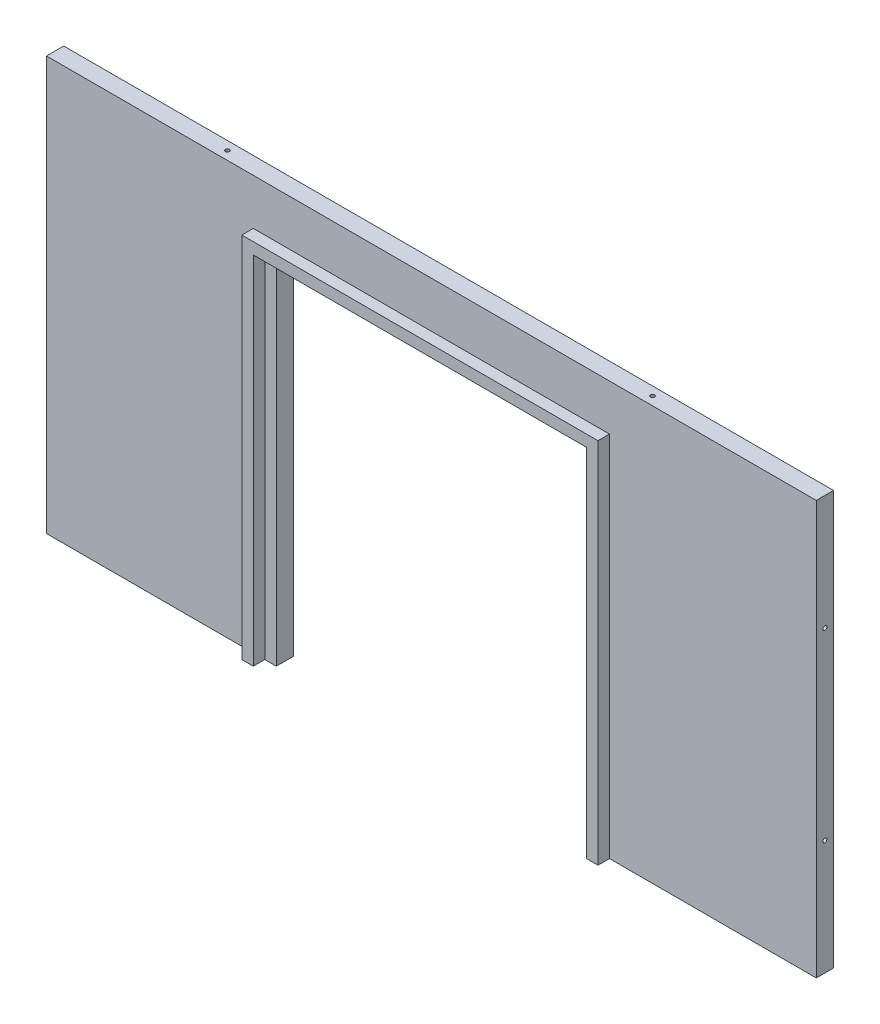
ISO-10303-21;
HEADER;
FILE_DESCRIPTION(('STEP AP214'),'2;1');
FILE_NAME('part.step','',(''),(''),'','','');
FILE_SCHEMA(('AUTOMOTIVE_DESIGN { 1 0 10303 214 1 1 1 1 }'));
ENDSEC;
DATA;
#1=APPLICATION_CONTEXT('core data for automotive mechanical design processes');
#2=APPLICATION_PROTOCOL_DEFINITION('international standard','automotive_design',2000,#1);
#3=PRODUCT_CONTEXT('',#1,'mechanical');
#4=PRODUCT('Part','Part','',(#3));
#5=PRODUCT_RELATED_PRODUCT_CATEGORY('part','',(#4));
#6=PRODUCT_DEFINITION_FORMATION('','',#4);
#7=PRODUCT_DEFINITION_CONTEXT('part definition',#1,'design');
#8=PRODUCT_DEFINITION('design','',#6,#7);
#9=PRODUCT_DEFINITION_SHAPE('','',#8);
#10=(LENGTH_UNIT() NAMED_UNIT(*) SI_UNIT(.MILLI.,.METRE.));
#11=(NAMED_UNIT(*) PLANE_ANGLE_UNIT() SI_UNIT($,.RADIAN.));
#12=(NAMED_UNIT(*) SI_UNIT($,.STERADIAN.) SOLID_ANGLE_UNIT());
#13=UNCERTAINTY_MEASURE_WITH_UNIT(LENGTH_MEASURE(1.E-05),#10,'distance_accuracy_value','');
#14=(GEOMETRIC_REPRESENTATION_CONTEXT(3) GLOBAL_UNCERTAINTY_ASSIGNED_CONTEXT((#13)) GLOBAL_UNIT_ASSIGNED_CONTEXT((#10,
#11,#12)) REPRESENTATION_CONTEXT('',''));
#15=CARTESIAN_POINT('',(0.,0.,0.));
#16=DIRECTION('',(0.,0.,1.));
#17=DIRECTION('',(1.,0.,0.));
#18=AXIS2_PLACEMENT_3D('',#15,#16,#17);
#19=CARTESIAN_POINT('',(0.,0.,3.));
#20=DIRECTION('',(0.,0.,1.));
#21=DIRECTION('',(1.,0.,0.));
#22=AXIS2_PLACEMENT_3D('',#19,#20,#21);
#23=PLANE('',#22);
#24=DIRECTION('',(1.,0.,0.));
#25=VECTOR('',#24,1.);
#26=CARTESIAN_POINT('',(0.,26.,3.));
#27=LINE('',#26,#25);
#28=CARTESIAN_POINT('',(27.,26.,3.));
#29=VERTEX_POINT('',#28);
#30=CARTESIAN_POINT('',(29.,26.,3.));
#31=VERTEX_POINT('',#30);
#32=EDGE_CURVE('E234',#29,#31,#27,.T.);
#33=ORIENTED_EDGE('',*,*,#32,.F.);
#34=DIRECTION('',(0.,-1.,0.));
#35=VECTOR('',#34,1.);
#36=CARTESIAN_POINT('',(27.,0.,3.));
#37=LINE('',#36,#35);
#38=CARTESIAN_POINT('',(27.,-36.,3.));
#39=VERTEX_POINT('',#38);
#40=EDGE_CURVE('E210',#29,#39,#37,.T.);
#41=ORIENTED_EDGE('',*,*,#40,.T.);
#42=DIRECTION('',(1.,0.,0.));
#43=VECTOR('',#42,1.);
#44=CARTESIAN_POINT('',(0.,-36.,3.));
#45=LINE('',#44,#43);
#46=CARTESIAN_POINT('',(29.,-36.,3.));
#47=VERTEX_POINT('',#46);
#48=EDGE_CURVE('E228',#39,#47,#45,.T.);
#49=ORIENTED_EDGE('',*,*,#48,.T.);
#50=DIRECTION('',(0.,-1.,0.));
#51=VECTOR('',#50,1.);
#52=CARTESIAN_POINT('',(29.,0.,3.));
#53=LINE('',#52,#51);
#54=EDGE_CURVE('E230',#31,#47,#53,.T.);
#55=ORIENTED_EDGE('',*,*,#54,.F.);
#56=EDGE_LOOP('',(#33,#41,#49,#55));
#57=FACE_BOUND('',#56,.T.);
#58=ADVANCED_FACE('F41',(#57),#23,.T.);
#59=CARTESIAN_POINT('',(-67.,-36.,3.));
#60=DIRECTION('',(0.,1.,0.));
#61=DIRECTION('',(0.,0.,1.));
#62=AXIS2_PLACEMENT_3D('',#59,#60,#61);
#63=PLANE('',#62);
#64=CARTESIAN_POINT('',(37.,-36.,1.5));
#65=DIRECTION('',(0.,-1.,0.));
#66=DIRECTION('',(0.,0.,-1.));
#67=AXIS2_PLACEMENT_3D('',#64,#65,#66);
#68=CIRCLE('',#67,0.350000000000008);
#69=CARTESIAN_POINT('',(37.,-36.,1.14999999999999));
#70=VERTEX_POINT('',#69);
#71=EDGE_CURVE('E912',#70,#70,#68,.T.);
#72=ORIENTED_EDGE('',*,*,#71,.F.);
#73=EDGE_LOOP('',(#72));
#74=FACE_BOUND('',#73,.T.);
#75=DIRECTION('',(0.,0.,1.));
#76=VECTOR('',#75,1.);
#77=CARTESIAN_POINT('',(29.,-36.,0.));
#78=LINE('',#77,#76);
#79=CARTESIAN_POINT('',(29.,-36.,5.));
#80=VERTEX_POINT('',#79);
#81=EDGE_CURVE('E289',#47,#80,#78,.T.);
#82=ORIENTED_EDGE('',*,*,#81,.F.);
#83=ORIENTED_EDGE('',*,*,#48,.F.);
#84=DIRECTION('',(0.,0.,1.));
#85=VECTOR('',#84,1.);
#86=CARTESIAN_POINT('',(27.,-36.,0.));
#87=LINE('',#86,#85);
#88=CARTESIAN_POINT('',(27.,-36.,0.));
#89=VERTEX_POINT('',#88);
#90=EDGE_CURVE('E244',#89,#39,#87,.T.);
#91=ORIENTED_EDGE('',*,*,#90,.F.);
#92=DIRECTION('',(1.,0.,0.));
#93=VECTOR('',#92,1.);
#94=CARTESIAN_POINT('',(-67.,-36.,0.));
#95=LINE('',#94,#93);
#96=CARTESIAN_POINT('',(67.,-36.,0.));
#97=VERTEX_POINT('',#96);
#98=EDGE_CURVE('E308',#89,#97,#95,.T.);
#99=ORIENTED_EDGE('',*,*,#98,.T.);
#100=DIRECTION('',(0.,0.,-1.));
#101=VECTOR('',#100,1.);
#102=CARTESIAN_POINT('',(67.,-36.,3.));
#103=LINE('',#102,#101);
#104=CARTESIAN_POINT('',(67.,-36.,3.));
#105=VERTEX_POINT('',#104);
#106=EDGE_CURVE('E49',#105,#97,#103,.T.);
#107=ORIENTED_EDGE('',*,*,#106,.F.);
#108=DIRECTION('',(1.,0.,0.));
#109=VECTOR('',#108,1.);
#110=CARTESIAN_POINT('',(-67.,-36.,3.));
#111=LINE('',#110,#109);
#112=CARTESIAN_POINT('',(31.,-36.,3.));
#113=VERTEX_POINT('',#112);
#114=EDGE_CURVE('E297',#113,#105,#111,.T.);
#115=ORIENTED_EDGE('',*,*,#114,.F.);
#116=DIRECTION('',(0.,0.,-1.));
#117=VECTOR('',#116,1.);
#118=CARTESIAN_POINT('',(31.,-36.,5.));
#119=LINE('',#118,#117);
#120=CARTESIAN_POINT('',(31.,-36.,5.));
#121=VERTEX_POINT('',#120);
#122=EDGE_CURVE('E282',#121,#113,#119,.T.);
#123=ORIENTED_EDGE('',*,*,#122,.F.);
#124=DIRECTION('',(1.,0.,0.));
#125=VECTOR('',#124,1.);
#126=CARTESIAN_POINT('',(0.,-36.,5.));
#127=LINE('',#126,#125);
#128=EDGE_CURVE('E257',#80,#121,#127,.T.);
#129=ORIENTED_EDGE('',*,*,#128,.F.);
#130=EDGE_LOOP('',(#82,#83,#91,#99,#107,#115,#123,#129));
#131=FACE_BOUND('',#130,.T.);
#132=ADVANCED_FACE('F343',(#74,#131),#63,.F.);
#133=CARTESIAN_POINT('',(0.,0.,3.));
#134=DIRECTION('',(0.,0.,1.));
#135=DIRECTION('',(1.,0.,0.));
#136=AXIS2_PLACEMENT_3D('',#133,#134,#135);
#137=PLANE('',#136);
#138=DIRECTION('',(0.,-1.,0.));
#139=VECTOR('',#138,1.);
#140=CARTESIAN_POINT('',(-31.,0.,3.));
#141=LINE('',#140,#139);
#142=CARTESIAN_POINT('',(-31.,28.,3.));
#143=VERTEX_POINT('',#142);
#144=CARTESIAN_POINT('',(-31.,-36.,3.));
#145=VERTEX_POINT('',#144);
#146=EDGE_CURVE('E64',#143,#145,#141,.T.);
#147=ORIENTED_EDGE('',*,*,#146,.F.);
#148=DIRECTION('',(1.,0.,0.));
#149=VECTOR('',#148,1.);
#150=CARTESIAN_POINT('',(0.,28.,3.));
#151=LINE('',#150,#149);
#152=CARTESIAN_POINT('',(31.,28.,3.));
#153=VERTEX_POINT('',#152);
#154=EDGE_CURVE('E272',#143,#153,#151,.T.);
#155=ORIENTED_EDGE('',*,*,#154,.T.);
#156=DIRECTION('',(0.,1.,0.));
#157=VECTOR('',#156,1.);
#158=CARTESIAN_POINT('',(31.,0.,3.));
#159=LINE('',#158,#157);
#160=EDGE_CURVE('E241',#113,#153,#159,.T.);
#161=ORIENTED_EDGE('',*,*,#160,.F.);
#162=ORIENTED_EDGE('',*,*,#114,.T.);
#163=DIRECTION('',(0.,1.,0.));
#164=VECTOR('',#163,1.);
#165=CARTESIAN_POINT('',(67.,36.,3.));
#166=LINE('',#165,#164);
#167=CARTESIAN_POINT('',(67.,36.,3.));
#168=VERTEX_POINT('',#167);
#169=EDGE_CURVE('E301',#105,#168,#166,.T.);
#170=ORIENTED_EDGE('',*,*,#169,.T.);
#171=DIRECTION('',(-1.,0.,0.));
#172=VECTOR('',#171,1.);
#173=CARTESIAN_POINT('',(-67.,36.,3.));
#174=LINE('',#173,#172);
#175=CARTESIAN_POINT('',(-67.,36.,3.));
#176=VERTEX_POINT('',#175);
#177=EDGE_CURVE('E303',#168,#176,#174,.T.);
#178=ORIENTED_EDGE('',*,*,#177,.T.);
#179=DIRECTION('',(0.,-1.,0.));
#180=VECTOR('',#179,1.);
#181=CARTESIAN_POINT('',(-67.,36.,3.));
#182=LINE('',#181,#180);
#183=CARTESIAN_POINT('',(-67.,-36.,3.));
#184=VERTEX_POINT('',#183);
#185=EDGE_CURVE('E294',#176,#184,#182,.T.);
#186=ORIENTED_EDGE('',*,*,#185,.T.);
#187=EDGE_CURVE('E299',#184,#145,#111,.T.);
#188=ORIENTED_EDGE('',*,*,#187,.T.);
#189=EDGE_LOOP('',(#147,#155,#161,#162,#170,#178,#186,#188));
#190=FACE_BOUND('',#189,.T.);
#191=ADVANCED_FACE('F340',(#190),#137,.T.);
#192=CARTESIAN_POINT('',(0.,0.,0.));
#193=DIRECTION('',(0.,0.,1.));
#194=DIRECTION('',(1.,0.,0.));
#195=AXIS2_PLACEMENT_3D('',#192,#193,#194);
#196=PLANE('',#195);
#197=ORIENTED_EDGE('',*,*,#98,.F.);
#198=DIRECTION('',(0.,-1.,0.));
#199=VECTOR('',#198,1.);
#200=CARTESIAN_POINT('',(27.,0.,0.));
#201=LINE('',#200,#199);
#202=CARTESIAN_POINT('',(27.,24.,0.));
#203=VERTEX_POINT('',#202);
#204=EDGE_CURVE('E218',#203,#89,#201,.T.);
#205=ORIENTED_EDGE('',*,*,#204,.F.);
#206=DIRECTION('',(1.,0.,0.));
#207=VECTOR('',#206,1.);
#208=CARTESIAN_POINT('',(0.,24.,0.));
#209=LINE('',#208,#207);
#210=CARTESIAN_POINT('',(-27.,24.,0.));
#211=VERTEX_POINT('',#210);
#212=EDGE_CURVE('E215',#211,#203,#209,.T.);
#213=ORIENTED_EDGE('',*,*,#212,.F.);
#214=DIRECTION('',(0.,-1.,0.));
#215=VECTOR('',#214,1.);
#216=CARTESIAN_POINT('',(-27.,0.,0.));
#217=LINE('',#216,#215);
#218=CARTESIAN_POINT('',(-27.,-36.,0.));
#219=VERTEX_POINT('',#218);
#220=EDGE_CURVE('E222',#211,#219,#217,.T.);
#221=ORIENTED_EDGE('',*,*,#220,.T.);
#222=CARTESIAN_POINT('',(-67.,-36.,0.));
#223=VERTEX_POINT('',#222);
#224=EDGE_CURVE('E309',#223,#219,#95,.T.);
#225=ORIENTED_EDGE('',*,*,#224,.F.);
#226=DIRECTION('',(0.,-1.,0.));
#227=VECTOR('',#226,1.);
#228=CARTESIAN_POINT('',(-67.,36.,0.));
#229=LINE('',#228,#227);
#230=CARTESIAN_POINT('',(-67.,36.,0.));
#231=VERTEX_POINT('',#230);
#232=EDGE_CURVE('E293',#231,#223,#229,.T.);
#233=ORIENTED_EDGE('',*,*,#232,.F.);
#234=DIRECTION('',(-1.,0.,0.));
#235=VECTOR('',#234,1.);
#236=CARTESIAN_POINT('',(-67.,36.,0.));
#237=LINE('',#236,#235);
#238=CARTESIAN_POINT('',(67.,36.,0.));
#239=VERTEX_POINT('',#238);
#240=EDGE_CURVE('E298',#239,#231,#237,.T.);
#241=ORIENTED_EDGE('',*,*,#240,.F.);
#242=DIRECTION('',(0.,1.,0.));
#243=VECTOR('',#242,1.);
#244=CARTESIAN_POINT('',(67.,36.,0.));
#245=LINE('',#244,#243);
#246=EDGE_CURVE('E311',#97,#239,#245,.T.);
#247=ORIENTED_EDGE('',*,*,#246,.F.);
#248=EDGE_LOOP('',(#197,#205,#213,#221,#225,#233,#241,#247));
#249=FACE_BOUND('',#248,.T.);
#250=ADVANCED_FACE('F329',(#249),#196,.F.);
#251=CARTESIAN_POINT('',(-67.,36.,3.));
#252=DIRECTION('',(1.,0.,0.));
#253=DIRECTION('',(0.,0.,-1.));
#254=AXIS2_PLACEMENT_3D('',#251,#252,#253);
#255=PLANE('',#254);
#256=CARTESIAN_POINT('',(-67.,16.,1.5));
#257=DIRECTION('',(1.,0.,0.));
#258=DIRECTION('',(0.,0.,-1.));
#259=AXIS2_PLACEMENT_3D('',#256,#257,#258);
#260=CIRCLE('',#259,0.349999999999999);
#261=CARTESIAN_POINT('',(-67.,16.,1.15));
#262=VERTEX_POINT('',#261);
#263=EDGE_CURVE('E874',#262,#262,#260,.T.);
#264=ORIENTED_EDGE('',*,*,#263,.T.);
#265=EDGE_LOOP('',(#264));
#266=FACE_BOUND('',#265,.T.);
#267=CARTESIAN_POINT('',(-67.,-16.,1.5));
#268=DIRECTION('',(1.,0.,0.));
#269=DIRECTION('',(0.,0.,-1.));
#270=AXIS2_PLACEMENT_3D('',#267,#268,#269);
#271=CIRCLE('',#270,0.349999999999999);
#272=CARTESIAN_POINT('',(-67.,-16.,1.15));
#273=VERTEX_POINT('',#272);
#274=EDGE_CURVE('E880',#273,#273,#271,.T.);
#275=ORIENTED_EDGE('',*,*,#274,.T.);
#276=EDGE_LOOP('',(#275));
#277=FACE_BOUND('',#276,.T.);
#278=ORIENTED_EDGE('',*,*,#232,.T.);
#279=DIRECTION('',(0.,0.,-1.));
#280=VECTOR('',#279,1.);
#281=CARTESIAN_POINT('',(-67.,-36.,3.));
#282=LINE('',#281,#280);
#283=EDGE_CURVE('E11',#184,#223,#282,.T.);
#284=ORIENTED_EDGE('',*,*,#283,.F.);
#285=ORIENTED_EDGE('',*,*,#185,.F.);
#286=DIRECTION('',(0.,0.,-1.));
#287=VECTOR('',#286,1.);
#288=CARTESIAN_POINT('',(-67.,36.,3.));
#289=LINE('',#288,#287);
#290=EDGE_CURVE('E305',#176,#231,#289,.T.);
#291=ORIENTED_EDGE('',*,*,#290,.T.);
#292=EDGE_LOOP('',(#278,#284,#285,#291));
#293=FACE_BOUND('',#292,.T.);
#294=ADVANCED_FACE('F43',(#266,#277,#293),#255,.F.);
#295=CARTESIAN_POINT('',(-37.,-36.,1.5));
#296=DIRECTION('',(0.,-1.,0.));
#297=DIRECTION('',(0.,0.,-1.));
#298=AXIS2_PLACEMENT_3D('',#295,#296,#297);
#299=CIRCLE('',#298,0.350000000000001);
#300=CARTESIAN_POINT('',(-37.,-36.,1.15));
#301=VERTEX_POINT('',#300);
#302=EDGE_CURVE('E910',#301,#301,#299,.T.);
#303=ORIENTED_EDGE('',*,*,#302,.F.);
#304=EDGE_LOOP('',(#303));
#305=FACE_BOUND('',#304,.T.);
#306=ORIENTED_EDGE('',*,*,#224,.T.);
#307=DIRECTION('',(0.,0.,1.));
#308=VECTOR('',#307,1.);
#309=CARTESIAN_POINT('',(-27.,-36.,0.));
#310=LINE('',#309,#308);
#311=CARTESIAN_POINT('',(-27.,-36.,3.));
#312=VERTEX_POINT('',#311);
#313=EDGE_CURVE('E242',#219,#312,#310,.T.);
#314=ORIENTED_EDGE('',*,*,#313,.T.);
#315=CARTESIAN_POINT('',(-29.,-36.,3.));
#316=VERTEX_POINT('',#315);
#317=EDGE_CURVE('E231',#316,#312,#45,.T.);
#318=ORIENTED_EDGE('',*,*,#317,.F.);
#319=DIRECTION('',(0.,0.,1.));
#320=VECTOR('',#319,1.);
#321=CARTESIAN_POINT('',(-29.,-36.,0.));
#322=LINE('',#321,#320);
#323=CARTESIAN_POINT('',(-29.,-36.,5.));
#324=VERTEX_POINT('',#323);
#325=EDGE_CURVE('E287',#316,#324,#322,.T.);
#326=ORIENTED_EDGE('',*,*,#325,.T.);
#327=DIRECTION('',(1.,0.,0.));
#328=VECTOR('',#327,1.);
#329=CARTESIAN_POINT('',(0.,-36.,5.));
#330=LINE('',#329,#328);
#331=CARTESIAN_POINT('',(-31.,-36.,5.));
#332=VERTEX_POINT('',#331);
#333=EDGE_CURVE('E266',#332,#324,#330,.T.);
#334=ORIENTED_EDGE('',*,*,#333,.F.);
#335=DIRECTION('',(0.,0.,-1.));
#336=VECTOR('',#335,1.);
#337=CARTESIAN_POINT('',(-31.,-36.,5.));
#338=LINE('',#337,#336);
#339=EDGE_CURVE('E269',#332,#145,#338,.T.);
#340=ORIENTED_EDGE('',*,*,#339,.T.);
#341=ORIENTED_EDGE('',*,*,#187,.F.);
#342=ORIENTED_EDGE('',*,*,#283,.T.);
#343=EDGE_LOOP('',(#306,#314,#318,#326,#334,#340,#341,#342));
#344=FACE_BOUND('',#343,.T.);
#345=ADVANCED_FACE('F379',(#305,#344),#63,.F.);
#346=CARTESIAN_POINT('',(67.,36.,3.));
#347=DIRECTION('',(-1.,0.,0.));
#348=DIRECTION('',(0.,0.,1.));
#349=AXIS2_PLACEMENT_3D('',#346,#347,#348);
#350=PLANE('',#349);
#351=CARTESIAN_POINT('',(67.,-16.,1.5));
#352=DIRECTION('',(1.,0.,0.));
#353=DIRECTION('',(0.,0.,-1.));
#354=AXIS2_PLACEMENT_3D('',#351,#352,#353);
#355=CIRCLE('',#354,0.349999999999999);
#356=CARTESIAN_POINT('',(67.,-16.,1.15));
#357=VERTEX_POINT('',#356);
#358=EDGE_CURVE('E892',#357,#357,#355,.T.);
#359=ORIENTED_EDGE('',*,*,#358,.F.);
#360=EDGE_LOOP('',(#359));
#361=FACE_BOUND('',#360,.T.);
#362=CARTESIAN_POINT('',(67.,16.,1.5));
#363=DIRECTION('',(1.,0.,0.));
#364=DIRECTION('',(0.,0.,-1.));
#365=AXIS2_PLACEMENT_3D('',#362,#363,#364);
#366=CIRCLE('',#365,0.349999999999999);
#367=CARTESIAN_POINT('',(67.,16.,1.15));
#368=VERTEX_POINT('',#367);
#369=EDGE_CURVE('E877',#368,#368,#366,.T.);
#370=ORIENTED_EDGE('',*,*,#369,.F.);
#371=EDGE_LOOP('',(#370));
#372=FACE_BOUND('',#371,.T.);
#373=ORIENTED_EDGE('',*,*,#246,.T.);
#374=DIRECTION('',(0.,0.,-1.));
#375=VECTOR('',#374,1.);
#376=CARTESIAN_POINT('',(67.,36.,3.));
#377=LINE('',#376,#375);
#378=EDGE_CURVE('E316',#168,#239,#377,.T.);
#379=ORIENTED_EDGE('',*,*,#378,.F.);
#380=ORIENTED_EDGE('',*,*,#169,.F.);
#381=ORIENTED_EDGE('',*,*,#106,.T.);
#382=EDGE_LOOP('',(#373,#379,#380,#381));
#383=FACE_BOUND('',#382,.T.);
#384=ADVANCED_FACE('F323',(#361,#372,#383),#350,.F.);
#385=CARTESIAN_POINT('',(-67.,36.,3.));
#386=DIRECTION('',(0.,-1.,0.));
#387=DIRECTION('',(0.,0.,-1.));
#388=AXIS2_PLACEMENT_3D('',#385,#386,#387);
#389=PLANE('',#388);
#390=CARTESIAN_POINT('',(-37.,36.,1.5));
#391=DIRECTION('',(0.,-1.,0.));
#392=DIRECTION('',(0.,0.,-1.));
#393=AXIS2_PLACEMENT_3D('',#390,#391,#392);
#394=CIRCLE('',#393,0.350000000000001);
#395=CARTESIAN_POINT('',(-37.,36.,1.15));
#396=VERTEX_POINT('',#395);
#397=EDGE_CURVE('E900',#396,#396,#394,.T.);
#398=ORIENTED_EDGE('',*,*,#397,.T.);
#399=EDGE_LOOP('',(#398));
#400=FACE_BOUND('',#399,.T.);
#401=CARTESIAN_POINT('',(37.,36.,1.5));
#402=DIRECTION('',(0.,-1.,0.));
#403=DIRECTION('',(0.,0.,-1.));
#404=AXIS2_PLACEMENT_3D('',#401,#402,#403);
#405=CIRCLE('',#404,0.350000000000008);
#406=CARTESIAN_POINT('',(37.,36.,1.14999999999999));
#407=VERTEX_POINT('',#406);
#408=EDGE_CURVE('E903',#407,#407,#405,.T.);
#409=ORIENTED_EDGE('',*,*,#408,.T.);
#410=EDGE_LOOP('',(#409));
#411=FACE_BOUND('',#410,.T.);
#412=ORIENTED_EDGE('',*,*,#240,.T.);
#413=ORIENTED_EDGE('',*,*,#290,.F.);
#414=ORIENTED_EDGE('',*,*,#177,.F.);
#415=ORIENTED_EDGE('',*,*,#378,.T.);
#416=EDGE_LOOP('',(#412,#413,#414,#415));
#417=FACE_BOUND('',#416,.T.);
#418=ADVANCED_FACE('F335',(#400,#411,#417),#389,.F.);
#419=CARTESIAN_POINT('',(-29.,26.,0.));
#420=DIRECTION('',(0.,-1.,0.));
#421=DIRECTION('',(1.,0.,0.));
#422=AXIS2_PLACEMENT_3D('',#419,#420,#421);
#423=PLANE('',#422);
#424=CARTESIAN_POINT('',(-29.,26.,3.));
#425=VERTEX_POINT('',#424);
#426=CARTESIAN_POINT('',(-27.,26.,3.));
#427=VERTEX_POINT('',#426);
#428=EDGE_CURVE('E56',#425,#427,#27,.T.);
#429=ORIENTED_EDGE('',*,*,#428,.T.);
#430=EDGE_CURVE('E237',#427,#29,#27,.T.);
#431=ORIENTED_EDGE('',*,*,#430,.T.);
#432=ORIENTED_EDGE('',*,*,#32,.T.);
#433=DIRECTION('',(0.,0.,1.));
#434=VECTOR('',#433,1.);
#435=CARTESIAN_POINT('',(29.,26.,0.));
#436=LINE('',#435,#434);
#437=CARTESIAN_POINT('',(29.,26.,5.));
#438=VERTEX_POINT('',#437);
#439=EDGE_CURVE('E291',#31,#438,#436,.T.);
#440=ORIENTED_EDGE('',*,*,#439,.T.);
#441=DIRECTION('',(1.,0.,0.));
#442=VECTOR('',#441,1.);
#443=CARTESIAN_POINT('',(0.,26.,5.));
#444=LINE('',#443,#442);
#445=CARTESIAN_POINT('',(-29.,26.,5.));
#446=VERTEX_POINT('',#445);
#447=EDGE_CURVE('E251',#446,#438,#444,.T.);
#448=ORIENTED_EDGE('',*,*,#447,.F.);
#449=DIRECTION('',(0.,0.,1.));
#450=VECTOR('',#449,1.);
#451=CARTESIAN_POINT('',(-29.,26.,0.));
#452=LINE('',#451,#450);
#453=EDGE_CURVE('E285',#425,#446,#452,.T.);
#454=ORIENTED_EDGE('',*,*,#453,.F.);
#455=EDGE_LOOP('',(#429,#431,#432,#440,#448,#454));
#456=FACE_BOUND('',#455,.T.);
#457=ADVANCED_FACE('F372',(#456),#423,.T.);
#458=CARTESIAN_POINT('',(29.,26.,0.));
#459=DIRECTION('',(-1.,0.,0.));
#460=DIRECTION('',(0.,-1.,0.));
#461=AXIS2_PLACEMENT_3D('',#458,#459,#460);
#462=PLANE('',#461);
#463=ORIENTED_EDGE('',*,*,#54,.T.);
#464=ORIENTED_EDGE('',*,*,#81,.T.);
#465=DIRECTION('',(0.,1.,0.));
#466=VECTOR('',#465,1.);
#467=CARTESIAN_POINT('',(29.,0.,5.));
#468=LINE('',#467,#466);
#469=EDGE_CURVE('E254',#80,#438,#468,.T.);
#470=ORIENTED_EDGE('',*,*,#469,.T.);
#471=ORIENTED_EDGE('',*,*,#439,.F.);
#472=EDGE_LOOP('',(#463,#464,#470,#471));
#473=FACE_BOUND('',#472,.T.);
#474=ADVANCED_FACE('F356',(#473),#462,.T.);
#475=CARTESIAN_POINT('',(-29.,26.,0.));
#476=DIRECTION('',(-1.,0.,0.));
#477=DIRECTION('',(0.,-1.,0.));
#478=AXIS2_PLACEMENT_3D('',#475,#476,#477);
#479=PLANE('',#478);
#480=ORIENTED_EDGE('',*,*,#325,.F.);
#481=DIRECTION('',(0.,-1.,0.));
#482=VECTOR('',#481,1.);
#483=CARTESIAN_POINT('',(-29.,0.,3.));
#484=LINE('',#483,#482);
#485=EDGE_CURVE('E236',#425,#316,#484,.T.);
#486=ORIENTED_EDGE('',*,*,#485,.F.);
#487=ORIENTED_EDGE('',*,*,#453,.T.);
#488=DIRECTION('',(0.,-1.,0.));
#489=VECTOR('',#488,1.);
#490=CARTESIAN_POINT('',(-29.,0.,5.));
#491=LINE('',#490,#489);
#492=EDGE_CURVE('E248',#446,#324,#491,.T.);
#493=ORIENTED_EDGE('',*,*,#492,.T.);
#494=EDGE_LOOP('',(#480,#486,#487,#493));
#495=FACE_BOUND('',#494,.T.);
#496=ADVANCED_FACE('F376',(#495),#479,.F.);
#497=CARTESIAN_POINT('',(31.,0.,5.));
#498=DIRECTION('',(-1.,0.,0.));
#499=DIRECTION('',(0.,-1.,0.));
#500=AXIS2_PLACEMENT_3D('',#497,#498,#499);
#501=PLANE('',#500);
#502=ORIENTED_EDGE('',*,*,#160,.T.);
#503=DIRECTION('',(0.,0.,-1.));
#504=VECTOR('',#503,1.);
#505=CARTESIAN_POINT('',(31.,28.,5.));
#506=LINE('',#505,#504);
#507=CARTESIAN_POINT('',(31.,28.,5.));
#508=VERTEX_POINT('',#507);
#509=EDGE_CURVE('E279',#508,#153,#506,.T.);
#510=ORIENTED_EDGE('',*,*,#509,.F.);
#511=DIRECTION('',(0.,1.,0.));
#512=VECTOR('',#511,1.);
#513=CARTESIAN_POINT('',(31.,0.,5.));
#514=LINE('',#513,#512);
#515=EDGE_CURVE('E259',#121,#508,#514,.T.);
#516=ORIENTED_EDGE('',*,*,#515,.F.);
#517=ORIENTED_EDGE('',*,*,#122,.T.);
#518=EDGE_LOOP('',(#502,#510,#516,#517));
#519=FACE_BOUND('',#518,.T.);
#520=ADVANCED_FACE('F347',(#519),#501,.F.);
#521=CARTESIAN_POINT('',(0.,28.,5.));
#522=DIRECTION('',(0.,1.,0.));
#523=DIRECTION('',(0.,0.,1.));
#524=AXIS2_PLACEMENT_3D('',#521,#522,#523);
#525=PLANE('',#524);
#526=ORIENTED_EDGE('',*,*,#154,.F.);
#527=DIRECTION('',(0.,0.,-1.));
#528=VECTOR('',#527,1.);
#529=CARTESIAN_POINT('',(-31.,28.,5.));
#530=LINE('',#529,#528);
#531=CARTESIAN_POINT('',(-31.,28.,5.));
#532=VERTEX_POINT('',#531);
#533=EDGE_CURVE('E277',#532,#143,#530,.T.);
#534=ORIENTED_EDGE('',*,*,#533,.F.);
#535=DIRECTION('',(1.,0.,0.));
#536=VECTOR('',#535,1.);
#537=CARTESIAN_POINT('',(0.,28.,5.));
#538=LINE('',#537,#536);
#539=EDGE_CURVE('E261',#532,#508,#538,.T.);
#540=ORIENTED_EDGE('',*,*,#539,.T.);
#541=ORIENTED_EDGE('',*,*,#509,.T.);
#542=EDGE_LOOP('',(#526,#534,#540,#541));
#543=FACE_BOUND('',#542,.T.);
#544=ADVANCED_FACE('F488',(#543),#525,.T.);
#545=CARTESIAN_POINT('',(-31.,0.,5.));
#546=DIRECTION('',(1.,0.,0.));
#547=DIRECTION('',(0.,0.,-1.));
#548=AXIS2_PLACEMENT_3D('',#545,#546,#547);
#549=PLANE('',#548);
#550=ORIENTED_EDGE('',*,*,#146,.T.);
#551=ORIENTED_EDGE('',*,*,#339,.F.);
#552=DIRECTION('',(0.,-1.,0.));
#553=VECTOR('',#552,1.);
#554=CARTESIAN_POINT('',(-31.,0.,5.));
#555=LINE('',#554,#553);
#556=EDGE_CURVE('E264',#532,#332,#555,.T.);
#557=ORIENTED_EDGE('',*,*,#556,.F.);
#558=ORIENTED_EDGE('',*,*,#533,.T.);
#559=EDGE_LOOP('',(#550,#551,#557,#558));
#560=FACE_BOUND('',#559,.T.);
#561=ADVANCED_FACE('F391',(#560),#549,.F.);
#562=CARTESIAN_POINT('',(0.,0.,5.));
#563=DIRECTION('',(0.,0.,1.));
#564=DIRECTION('',(1.,0.,0.));
#565=AXIS2_PLACEMENT_3D('',#562,#563,#564);
#566=PLANE('',#565);
#567=ORIENTED_EDGE('',*,*,#492,.F.);
#568=ORIENTED_EDGE('',*,*,#447,.T.);
#569=ORIENTED_EDGE('',*,*,#469,.F.);
#570=ORIENTED_EDGE('',*,*,#128,.T.);
#571=ORIENTED_EDGE('',*,*,#515,.T.);
#572=ORIENTED_EDGE('',*,*,#539,.F.);
#573=ORIENTED_EDGE('',*,*,#556,.T.);
#574=ORIENTED_EDGE('',*,*,#333,.T.);
#575=EDGE_LOOP('',(#567,#568,#569,#570,#571,#572,#573,#574));
#576=FACE_BOUND('',#575,.T.);
#577=ADVANCED_FACE('F352',(#576),#566,.T.);
#578=CARTESIAN_POINT('',(0.,24.,0.));
#579=DIRECTION('',(0.,-1.,0.));
#580=DIRECTION('',(0.,0.,-1.));
#581=AXIS2_PLACEMENT_3D('',#578,#579,#580);
#582=PLANE('',#581);
#583=DIRECTION('',(1.,0.,0.));
#584=VECTOR('',#583,1.);
#585=CARTESIAN_POINT('',(-27.,24.,1.5));
#586=LINE('',#585,#584);
#587=CARTESIAN_POINT('',(-27.,24.,1.5));
#588=VERTEX_POINT('',#587);
#589=CARTESIAN_POINT('',(27.,24.,1.5));
#590=VERTEX_POINT('',#589);
#591=EDGE_CURVE('E198',#588,#590,#586,.T.);
#592=ORIENTED_EDGE('',*,*,#591,.F.);
#593=DIRECTION('',(0.,0.,1.));
#594=VECTOR('',#593,1.);
#595=CARTESIAN_POINT('',(-27.,24.,0.));
#596=LINE('',#595,#594);
#597=EDGE_CURVE('E181',#211,#588,#596,.T.);
#598=ORIENTED_EDGE('',*,*,#597,.F.);
#599=ORIENTED_EDGE('',*,*,#212,.T.);
#600=DIRECTION('',(0.,0.,1.));
#601=VECTOR('',#600,1.);
#602=CARTESIAN_POINT('',(27.,24.,0.));
#603=LINE('',#602,#601);
#604=EDGE_CURVE('E225',#203,#590,#603,.T.);
#605=ORIENTED_EDGE('',*,*,#604,.T.);
#606=EDGE_LOOP('',(#592,#598,#599,#605));
#607=FACE_BOUND('',#606,.T.);
#608=ADVANCED_FACE('F383',(#607),#582,.T.);
#609=CARTESIAN_POINT('',(-27.,0.,0.));
#610=DIRECTION('',(-1.,0.,0.));
#611=DIRECTION('',(0.,-1.,0.));
#612=AXIS2_PLACEMENT_3D('',#609,#610,#611);
#613=PLANE('',#612);
#614=DIRECTION('',(0.,-1.,0.));
#615=VECTOR('',#614,1.);
#616=CARTESIAN_POINT('',(-27.,0.,3.));
#617=LINE('',#616,#615);
#618=EDGE_CURVE('E219',#427,#312,#617,.T.);
#619=ORIENTED_EDGE('',*,*,#618,.T.);
#620=ORIENTED_EDGE('',*,*,#313,.F.);
#621=ORIENTED_EDGE('',*,*,#220,.F.);
#622=ORIENTED_EDGE('',*,*,#597,.T.);
#623=DIRECTION('',(0.,-1.,0.));
#624=VECTOR('',#623,1.);
#625=CARTESIAN_POINT('',(-27.,27.,1.5));
#626=LINE('',#625,#624);
#627=CARTESIAN_POINT('',(-27.,27.,1.5));
#628=VERTEX_POINT('',#627);
#629=EDGE_CURVE('E173',#628,#588,#626,.T.);
#630=ORIENTED_EDGE('',*,*,#629,.F.);
#631=DIRECTION('',(0.,0.,-1.));
#632=VECTOR('',#631,1.);
#633=CARTESIAN_POINT('',(-27.,27.,3.));
#634=LINE('',#633,#632);
#635=CARTESIAN_POINT('',(-27.,27.,3.));
#636=VERTEX_POINT('',#635);
#637=EDGE_CURVE('E179',#636,#628,#634,.T.);
#638=ORIENTED_EDGE('',*,*,#637,.F.);
#639=DIRECTION('',(0.,-1.,0.));
#640=VECTOR('',#639,1.);
#641=CARTESIAN_POINT('',(-27.,27.,3.));
#642=LINE('',#641,#640);
#643=EDGE_CURVE('E208',#636,#427,#642,.T.);
#644=ORIENTED_EDGE('',*,*,#643,.T.);
#645=EDGE_LOOP('',(#619,#620,#621,#622,#630,#638,#644));
#646=FACE_BOUND('',#645,.T.);
#647=ADVANCED_FACE('F176',(#646),#613,.F.);
#648=CARTESIAN_POINT('',(27.,0.,0.));
#649=DIRECTION('',(-1.,0.,0.));
#650=DIRECTION('',(0.,-1.,0.));
#651=AXIS2_PLACEMENT_3D('',#648,#649,#650);
#652=PLANE('',#651);
#653=ORIENTED_EDGE('',*,*,#40,.F.);
#654=DIRECTION('',(0.,-1.,0.));
#655=VECTOR('',#654,1.);
#656=CARTESIAN_POINT('',(27.,27.,3.));
#657=LINE('',#656,#655);
#658=CARTESIAN_POINT('',(27.,27.,3.));
#659=VERTEX_POINT('',#658);
#660=EDGE_CURVE('E211',#659,#29,#657,.T.);
#661=ORIENTED_EDGE('',*,*,#660,.F.);
#662=DIRECTION('',(0.,0.,-1.));
#663=VECTOR('',#662,1.);
#664=CARTESIAN_POINT('',(27.,27.,3.));
#665=LINE('',#664,#663);
#666=CARTESIAN_POINT('',(27.,27.,1.5));
#667=VERTEX_POINT('',#666);
#668=EDGE_CURVE('E194',#659,#667,#665,.T.);
#669=ORIENTED_EDGE('',*,*,#668,.T.);
#670=DIRECTION('',(0.,-1.,0.));
#671=VECTOR('',#670,1.);
#672=CARTESIAN_POINT('',(27.,27.,1.5));
#673=LINE('',#672,#671);
#674=EDGE_CURVE('E185',#667,#590,#673,.T.);
#675=ORIENTED_EDGE('',*,*,#674,.T.);
#676=ORIENTED_EDGE('',*,*,#604,.F.);
#677=ORIENTED_EDGE('',*,*,#204,.T.);
#678=ORIENTED_EDGE('',*,*,#90,.T.);
#679=EDGE_LOOP('',(#653,#661,#669,#675,#676,#677,#678));
#680=FACE_BOUND('',#679,.T.);
#681=ADVANCED_FACE('F364',(#680),#652,.T.);
#682=ORIENTED_EDGE('',*,*,#618,.F.);
#683=ORIENTED_EDGE('',*,*,#428,.F.);
#684=ORIENTED_EDGE('',*,*,#485,.T.);
#685=ORIENTED_EDGE('',*,*,#317,.T.);
#686=EDGE_LOOP('',(#682,#683,#684,#685));
#687=FACE_BOUND('',#686,.T.);
#688=ADVANCED_FACE('F377',(#687),#23,.T.);
#689=CARTESIAN_POINT('',(-27.,27.,3.));
#690=DIRECTION('',(0.,0.,-1.));
#691=DIRECTION('',(-1.,0.,0.));
#692=AXIS2_PLACEMENT_3D('',#689,#690,#691);
#693=PLANE('',#692);
#694=ORIENTED_EDGE('',*,*,#643,.F.);
#695=DIRECTION('',(1.,0.,0.));
#696=VECTOR('',#695,1.);
#697=CARTESIAN_POINT('',(-27.,27.,3.));
#698=LINE('',#697,#696);
#699=EDGE_CURVE('E186',#636,#659,#698,.T.);
#700=ORIENTED_EDGE('',*,*,#699,.T.);
#701=ORIENTED_EDGE('',*,*,#660,.T.);
#702=ORIENTED_EDGE('',*,*,#430,.F.);
#703=EDGE_LOOP('',(#694,#700,#701,#702));
#704=FACE_BOUND('',#703,.T.);
#705=ADVANCED_FACE('F367',(#704),#693,.T.);
#706=CARTESIAN_POINT('',(-27.,27.,1.5));
#707=DIRECTION('',(0.,0.,-1.));
#708=DIRECTION('',(-1.,0.,0.));
#709=AXIS2_PLACEMENT_3D('',#706,#707,#708);
#710=PLANE('',#709);
#711=ORIENTED_EDGE('',*,*,#591,.T.);
#712=ORIENTED_EDGE('',*,*,#674,.F.);
#713=DIRECTION('',(1.,0.,0.));
#714=VECTOR('',#713,1.);
#715=CARTESIAN_POINT('',(-27.,27.,1.5));
#716=LINE('',#715,#714);
#717=EDGE_CURVE('E190',#628,#667,#716,.T.);
#718=ORIENTED_EDGE('',*,*,#717,.F.);
#719=ORIENTED_EDGE('',*,*,#629,.T.);
#720=EDGE_LOOP('',(#711,#712,#718,#719));
#721=FACE_BOUND('',#720,.T.);
#722=ADVANCED_FACE('F191',(#721),#710,.F.);
#723=CARTESIAN_POINT('',(0.,27.,0.));
#724=DIRECTION('',(0.,-1.,0.));
#725=DIRECTION('',(0.,0.,-1.));
#726=AXIS2_PLACEMENT_3D('',#723,#724,#725);
#727=PLANE('',#726);
#728=ORIENTED_EDGE('',*,*,#637,.T.);
#729=ORIENTED_EDGE('',*,*,#717,.T.);
#730=ORIENTED_EDGE('',*,*,#668,.F.);
#731=ORIENTED_EDGE('',*,*,#699,.F.);
#732=EDGE_LOOP('',(#728,#729,#730,#731));
#733=FACE_BOUND('',#732,.T.);
#734=ADVANCED_FACE('F197',(#733),#727,.T.);
#735=CARTESIAN_POINT('',(-37.,-34.5,1.5));
#736=DIRECTION('',(0.,-1.,0.));
#737=DIRECTION('',(0.,0.,-1.));
#738=AXIS2_PLACEMENT_3D('',#735,#736,#737);
#739=CYLINDRICAL_SURFACE('',#738,0.350000000000001);
#740=CARTESIAN_POINT('',(-37.,-34.5,1.5));
#741=DIRECTION('',(0.,-1.,0.));
#742=DIRECTION('',(0.,0.,-1.));
#743=AXIS2_PLACEMENT_3D('',#740,#741,#742);
#744=CIRCLE('',#743,0.350000000000001);
#745=CARTESIAN_POINT('',(-37.,-34.5,1.15));
#746=VERTEX_POINT('',#745);
#747=EDGE_CURVE('E200',#746,#746,#744,.T.);
#748=ORIENTED_EDGE('',*,*,#747,.F.);
#749=EDGE_LOOP('',(#748));
#750=FACE_BOUND('',#749,.T.);
#751=ORIENTED_EDGE('',*,*,#302,.T.);
#752=EDGE_LOOP('',(#751));
#753=FACE_BOUND('',#752,.T.);
#754=ADVANCED_FACE('F540',(#750,#753),#739,.F.);
#755=CARTESIAN_POINT('',(-37.,-34.5,1.5));
#756=DIRECTION('',(0.,-1.,0.));
#757=DIRECTION('',(0.,0.,-1.));
#758=AXIS2_PLACEMENT_3D('',#755,#756,#757);
#759=PLANE('',#758);
#760=ORIENTED_EDGE('',*,*,#747,.T.);
#761=EDGE_LOOP('',(#760));
#762=FACE_BOUND('',#761,.T.);
#763=ADVANCED_FACE('F545',(#762),#759,.T.);
#764=CARTESIAN_POINT('',(37.,-34.5,1.5));
#765=DIRECTION('',(0.,-1.,0.));
#766=DIRECTION('',(0.,0.,-1.));
#767=AXIS2_PLACEMENT_3D('',#764,#765,#766);
#768=CYLINDRICAL_SURFACE('',#767,0.350000000000008);
#769=CARTESIAN_POINT('',(37.,-34.5,1.5));
#770=DIRECTION('',(0.,-1.,0.));
#771=DIRECTION('',(0.,0.,-1.));
#772=AXIS2_PLACEMENT_3D('',#769,#770,#771);
#773=CIRCLE('',#772,0.350000000000008);
#774=CARTESIAN_POINT('',(37.,-34.5,1.14999999999999));
#775=VERTEX_POINT('',#774);
#776=EDGE_CURVE('E203',#775,#775,#773,.T.);
#777=ORIENTED_EDGE('',*,*,#776,.F.);
#778=EDGE_LOOP('',(#777));
#779=FACE_BOUND('',#778,.T.);
#780=ORIENTED_EDGE('',*,*,#71,.T.);
#781=EDGE_LOOP('',(#780));
#782=FACE_BOUND('',#781,.T.);
#783=ADVANCED_FACE('F556',(#779,#782),#768,.F.);
#784=CARTESIAN_POINT('',(37.,-34.5,1.5));
#785=DIRECTION('',(0.,-1.,0.));
#786=DIRECTION('',(0.,0.,-1.));
#787=AXIS2_PLACEMENT_3D('',#784,#785,#786);
#788=PLANE('',#787);
#789=ORIENTED_EDGE('',*,*,#776,.T.);
#790=EDGE_LOOP('',(#789));
#791=FACE_BOUND('',#790,.T.);
#792=ADVANCED_FACE('F567',(#791),#788,.T.);
#793=CARTESIAN_POINT('',(37.,34.5,1.5));
#794=DIRECTION('',(0.,1.,0.));
#795=DIRECTION('',(0.,0.,1.));
#796=AXIS2_PLACEMENT_3D('',#793,#794,#795);
#797=CYLINDRICAL_SURFACE('',#796,0.350000000000008);
#798=CARTESIAN_POINT('',(37.,34.5,1.5));
#799=DIRECTION('',(0.,-1.,0.));
#800=DIRECTION('',(0.,0.,-1.));
#801=AXIS2_PLACEMENT_3D('',#798,#799,#800);
#802=CIRCLE('',#801,0.350000000000008);
#803=CARTESIAN_POINT('',(37.,34.5,1.14999999999999));
#804=VERTEX_POINT('',#803);
#805=EDGE_CURVE('E891',#804,#804,#802,.T.);
#806=ORIENTED_EDGE('',*,*,#805,.T.);
#807=EDGE_LOOP('',(#806));
#808=FACE_BOUND('',#807,.T.);
#809=ORIENTED_EDGE('',*,*,#408,.F.);
#810=EDGE_LOOP('',(#809));
#811=FACE_BOUND('',#810,.T.);
#812=ADVANCED_FACE('F578',(#808,#811),#797,.F.);
#813=CARTESIAN_POINT('',(37.,34.5,1.5));
#814=DIRECTION('',(0.,-1.,0.));
#815=DIRECTION('',(0.,0.,-1.));
#816=AXIS2_PLACEMENT_3D('',#813,#814,#815);
#817=PLANE('',#816);
#818=ORIENTED_EDGE('',*,*,#805,.F.);
#819=EDGE_LOOP('',(#818));
#820=FACE_BOUND('',#819,.T.);
#821=ADVANCED_FACE('F600',(#820),#817,.F.);
#822=CARTESIAN_POINT('',(-37.,34.5,1.5));
#823=DIRECTION('',(0.,1.,0.));
#824=DIRECTION('',(0.,0.,1.));
#825=AXIS2_PLACEMENT_3D('',#822,#823,#824);
#826=CYLINDRICAL_SURFACE('',#825,0.350000000000001);
#827=CARTESIAN_POINT('',(-37.,34.5,1.5));
#828=DIRECTION('',(0.,-1.,0.));
#829=DIRECTION('',(0.,0.,-1.));
#830=AXIS2_PLACEMENT_3D('',#827,#828,#829);
#831=CIRCLE('',#830,0.350000000000001);
#832=CARTESIAN_POINT('',(-37.,34.5,1.15));
#833=VERTEX_POINT('',#832);
#834=EDGE_CURVE('E897',#833,#833,#831,.T.);
#835=ORIENTED_EDGE('',*,*,#834,.T.);
#836=EDGE_LOOP('',(#835));
#837=FACE_BOUND('',#836,.T.);
#838=ORIENTED_EDGE('',*,*,#397,.F.);
#839=EDGE_LOOP('',(#838));
#840=FACE_BOUND('',#839,.T.);
#841=ADVANCED_FACE('F611',(#837,#840),#826,.F.);
#842=CARTESIAN_POINT('',(-37.,34.5,1.5));
#843=DIRECTION('',(0.,-1.,0.));
#844=DIRECTION('',(0.,0.,-1.));
#845=AXIS2_PLACEMENT_3D('',#842,#843,#844);
#846=PLANE('',#845);
#847=ORIENTED_EDGE('',*,*,#834,.F.);
#848=EDGE_LOOP('',(#847));
#849=FACE_BOUND('',#848,.T.);
#850=ADVANCED_FACE('F622',(#849),#846,.F.);
#851=CARTESIAN_POINT('',(65.5,16.,1.5));
#852=DIRECTION('',(1.,0.,0.));
#853=DIRECTION('',(0.,0.,-1.));
#854=AXIS2_PLACEMENT_3D('',#851,#852,#853);
#855=CYLINDRICAL_SURFACE('',#854,0.349999999999999);
#856=CARTESIAN_POINT('',(65.5,16.,1.5));
#857=DIRECTION('',(1.,0.,0.));
#858=DIRECTION('',(0.,0.,-1.));
#859=AXIS2_PLACEMENT_3D('',#856,#857,#858);
#860=CIRCLE('',#859,0.349999999999999);
#861=CARTESIAN_POINT('',(65.5,16.,1.15));
#862=VERTEX_POINT('',#861);
#863=EDGE_CURVE('E873',#862,#862,#860,.T.);
#864=ORIENTED_EDGE('',*,*,#863,.F.);
#865=EDGE_LOOP('',(#864));
#866=FACE_BOUND('',#865,.T.);
#867=ORIENTED_EDGE('',*,*,#369,.T.);
#868=EDGE_LOOP('',(#867));
#869=FACE_BOUND('',#868,.T.);
#870=ADVANCED_FACE('F633',(#866,#869),#855,.F.);
#871=CARTESIAN_POINT('',(65.5,16.,1.5));
#872=DIRECTION('',(1.,0.,0.));
#873=DIRECTION('',(0.,0.,-1.));
#874=AXIS2_PLACEMENT_3D('',#871,#872,#873);
#875=PLANE('',#874);
#876=ORIENTED_EDGE('',*,*,#863,.T.);
#877=EDGE_LOOP('',(#876));
#878=FACE_BOUND('',#877,.T.);
#879=ADVANCED_FACE('F649',(#878),#875,.T.);
#880=CARTESIAN_POINT('',(65.5,-16.,1.5));
#881=DIRECTION('',(1.,0.,0.));
#882=DIRECTION('',(0.,0.,-1.));
#883=AXIS2_PLACEMENT_3D('',#880,#881,#882);
#884=CYLINDRICAL_SURFACE('',#883,0.349999999999999);
#885=CARTESIAN_POINT('',(65.5,-16.,1.5));
#886=DIRECTION('',(1.,0.,0.));
#887=DIRECTION('',(0.,0.,-1.));
#888=AXIS2_PLACEMENT_3D('',#885,#886,#887);
#889=CIRCLE('',#888,0.349999999999999);
#890=CARTESIAN_POINT('',(65.5,-16.,1.15));
#891=VERTEX_POINT('',#890);
#892=EDGE_CURVE('E888',#891,#891,#889,.T.);
#893=ORIENTED_EDGE('',*,*,#892,.F.);
#894=EDGE_LOOP('',(#893));
#895=FACE_BOUND('',#894,.T.);
#896=ORIENTED_EDGE('',*,*,#358,.T.);
#897=EDGE_LOOP('',(#896));
#898=FACE_BOUND('',#897,.T.);
#899=ADVANCED_FACE('F660',(#895,#898),#884,.F.);
#900=CARTESIAN_POINT('',(65.5,-16.,1.5));
#901=DIRECTION('',(1.,0.,0.));
#902=DIRECTION('',(0.,0.,-1.));
#903=AXIS2_PLACEMENT_3D('',#900,#901,#902);
#904=PLANE('',#903);
#905=ORIENTED_EDGE('',*,*,#892,.T.);
#906=EDGE_LOOP('',(#905));
#907=FACE_BOUND('',#906,.T.);
#908=ADVANCED_FACE('F671',(#907),#904,.T.);
#909=CARTESIAN_POINT('',(-65.5,-16.,1.5));
#910=DIRECTION('',(-1.,0.,0.));
#911=DIRECTION('',(0.,0.,1.));
#912=AXIS2_PLACEMENT_3D('',#909,#910,#911);
#913=CYLINDRICAL_SURFACE('',#912,0.349999999999999);
#914=CARTESIAN_POINT('',(-65.5,-16.,1.5));
#915=DIRECTION('',(1.,0.,0.));
#916=DIRECTION('',(0.,0.,-1.));
#917=AXIS2_PLACEMENT_3D('',#914,#915,#916);
#918=CIRCLE('',#917,0.349999999999999);
#919=CARTESIAN_POINT('',(-65.5,-16.,1.15));
#920=VERTEX_POINT('',#919);
#921=EDGE_CURVE('E885',#920,#920,#918,.T.);
#922=ORIENTED_EDGE('',*,*,#921,.T.);
#923=EDGE_LOOP('',(#922));
#924=FACE_BOUND('',#923,.T.);
#925=ORIENTED_EDGE('',*,*,#274,.F.);
#926=EDGE_LOOP('',(#925));
#927=FACE_BOUND('',#926,.T.);
#928=ADVANCED_FACE('F682',(#924,#927),#913,.F.);
#929=CARTESIAN_POINT('',(-65.5,-16.,1.5));
#930=DIRECTION('',(1.,0.,0.));
#931=DIRECTION('',(0.,0.,-1.));
#932=AXIS2_PLACEMENT_3D('',#929,#930,#931);
#933=PLANE('',#932);
#934=ORIENTED_EDGE('',*,*,#921,.F.);
#935=EDGE_LOOP('',(#934));
#936=FACE_BOUND('',#935,.T.);
#937=ADVANCED_FACE('F698',(#936),#933,.F.);
#938=CARTESIAN_POINT('',(-65.5,16.,1.5));
#939=DIRECTION('',(-1.,0.,0.));
#940=DIRECTION('',(0.,0.,1.));
#941=AXIS2_PLACEMENT_3D('',#938,#939,#940);
#942=CYLINDRICAL_SURFACE('',#941,0.349999999999999);
#943=CARTESIAN_POINT('',(-65.5,16.,1.5));
#944=DIRECTION('',(1.,0.,0.));
#945=DIRECTION('',(0.,0.,-1.));
#946=AXIS2_PLACEMENT_3D('',#943,#944,#945);
#947=CIRCLE('',#946,0.349999999999999);
#948=CARTESIAN_POINT('',(-65.5,16.,1.15));
#949=VERTEX_POINT('',#948);
#950=EDGE_CURVE('E872',#949,#949,#947,.T.);
#951=ORIENTED_EDGE('',*,*,#950,.T.);
#952=EDGE_LOOP('',(#951));
#953=FACE_BOUND('',#952,.T.);
#954=ORIENTED_EDGE('',*,*,#263,.F.);
#955=EDGE_LOOP('',(#954));
#956=FACE_BOUND('',#955,.T.);
#957=ADVANCED_FACE('F709',(#953,#956),#942,.F.);
#958=CARTESIAN_POINT('',(-65.5,16.,1.5));
#959=DIRECTION('',(1.,0.,0.));
#960=DIRECTION('',(0.,0.,-1.));
#961=AXIS2_PLACEMENT_3D('',#958,#959,#960);
#962=PLANE('',#961);
#963=ORIENTED_EDGE('',*,*,#950,.F.);
#964=EDGE_LOOP('',(#963));
#965=FACE_BOUND('',#964,.T.);
#966=ADVANCED_FACE('F720',(#965),#962,.F.);
#967=CLOSED_SHELL('',(#58,#132,#191,#250,#294,#345,#384,#418,#457,#474,#496,#520,#544,#561,#577,
#608,#647,#681,#688,#705,#722,#734,#754,#763,#783,#792,#812,#821,#841,#850,#870,#879,#899,#908,
#928,#937,#957,#966));
#968=MANIFOLD_SOLID_BREP('B2',#967);
#969=ADVANCED_BREP_SHAPE_REPRESENTATION('',(#18,#968),#14);
#970=SHAPE_DEFINITION_REPRESENTATION(#9,#969);
ENDSEC;
END-ISO-10303-21;
